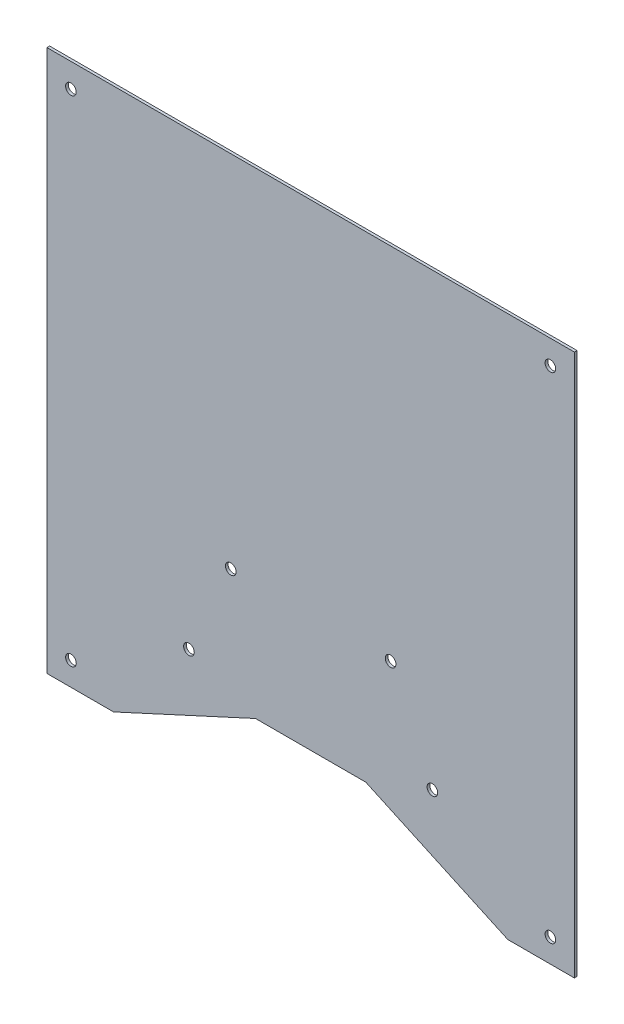
ISO-10303-21;
HEADER;
FILE_DESCRIPTION(('STEP AP214'),'2;1');
FILE_NAME('part.step','',(''),(''),'','','');
FILE_SCHEMA(('AUTOMOTIVE_DESIGN { 1 0 10303 214 1 1 1 1 }'));
ENDSEC;
DATA;
#1=APPLICATION_CONTEXT('core data for automotive mechanical design processes');
#2=APPLICATION_PROTOCOL_DEFINITION('international standard','automotive_design',2000,#1);
#3=PRODUCT_CONTEXT('',#1,'mechanical');
#4=PRODUCT('Part','Part','',(#3));
#5=PRODUCT_RELATED_PRODUCT_CATEGORY('part','',(#4));
#6=PRODUCT_DEFINITION_FORMATION('','',#4);
#7=PRODUCT_DEFINITION_CONTEXT('part definition',#1,'design');
#8=PRODUCT_DEFINITION('design','',#6,#7);
#9=PRODUCT_DEFINITION_SHAPE('','',#8);
#10=(LENGTH_UNIT() NAMED_UNIT(*) SI_UNIT(.MILLI.,.METRE.));
#11=(NAMED_UNIT(*) PLANE_ANGLE_UNIT() SI_UNIT($,.RADIAN.));
#12=(NAMED_UNIT(*) SI_UNIT($,.STERADIAN.) SOLID_ANGLE_UNIT());
#13=UNCERTAINTY_MEASURE_WITH_UNIT(LENGTH_MEASURE(1.E-05),#10,'distance_accuracy_value','');
#14=(GEOMETRIC_REPRESENTATION_CONTEXT(3) GLOBAL_UNCERTAINTY_ASSIGNED_CONTEXT((#13)) GLOBAL_UNIT_ASSIGNED_CONTEXT((#10,
#11,#12)) REPRESENTATION_CONTEXT('',''));
#15=CARTESIAN_POINT('',(0.,0.,0.));
#16=DIRECTION('',(0.,0.,1.));
#17=DIRECTION('',(1.,0.,0.));
#18=AXIS2_PLACEMENT_3D('',#15,#16,#17);
#19=CARTESIAN_POINT('',(0.,0.,0.));
#20=DIRECTION('',(0.,-1.,0.));
#21=DIRECTION('',(-1.,0.,0.));
#22=AXIS2_PLACEMENT_3D('',#19,#20,#21);
#23=PLANE('',#22);
#24=DIRECTION('',(0.,0.,1.));
#25=VECTOR('',#24,1.);
#26=CARTESIAN_POINT('',(-74.,0.,0.));
#27=LINE('',#26,#25);
#28=CARTESIAN_POINT('',(-74.,0.,0.));
#29=VERTEX_POINT('',#28);
#30=CARTESIAN_POINT('',(-74.,0.,1.));
#31=VERTEX_POINT('',#30);
#32=EDGE_CURVE('E142',#29,#31,#27,.T.);
#33=ORIENTED_EDGE('',*,*,#32,.T.);
#34=DIRECTION('',(1.,0.,0.));
#35=VECTOR('',#34,1.);
#36=CARTESIAN_POINT('',(-99.,0.,1.));
#37=LINE('',#36,#35);
#38=CARTESIAN_POINT('',(-99.,0.,1.));
#39=VERTEX_POINT('',#38);
#40=EDGE_CURVE('E206',#39,#31,#37,.T.);
#41=ORIENTED_EDGE('',*,*,#40,.F.);
#42=DIRECTION('',(0.,0.,-1.));
#43=VECTOR('',#42,1.);
#44=CARTESIAN_POINT('',(-99.,0.,1.));
#45=LINE('',#44,#43);
#46=CARTESIAN_POINT('',(-99.,0.,0.));
#47=VERTEX_POINT('',#46);
#48=EDGE_CURVE('E198',#39,#47,#45,.T.);
#49=ORIENTED_EDGE('',*,*,#48,.T.);
#50=DIRECTION('',(1.,0.,0.));
#51=VECTOR('',#50,1.);
#52=CARTESIAN_POINT('',(-99.,0.,0.));
#53=LINE('',#52,#51);
#54=EDGE_CURVE('E211',#47,#29,#53,.T.);
#55=ORIENTED_EDGE('',*,*,#54,.T.);
#56=EDGE_LOOP('',(#33,#41,#49,#55));
#57=FACE_BOUND('',#56,.T.);
#58=ADVANCED_FACE('F38',(#57),#23,.T.);
#59=CARTESIAN_POINT('',(-99.,203.5,1.));
#60=DIRECTION('',(0.,0.,-1.));
#61=DIRECTION('',(-1.,0.,0.));
#62=AXIS2_PLACEMENT_3D('',#59,#60,#61);
#63=PLANE('',#62);
#64=CARTESIAN_POINT('',(90.,194.5,1.));
#65=DIRECTION('',(0.,0.,1.));
#66=DIRECTION('',(1.,0.,0.));
#67=AXIS2_PLACEMENT_3D('',#64,#65,#66);
#68=CIRCLE('',#67,2.);
#69=CARTESIAN_POINT('',(92.,194.5,1.));
#70=VERTEX_POINT('',#69);
#71=EDGE_CURVE('E170',#70,#70,#68,.T.);
#72=ORIENTED_EDGE('',*,*,#71,.F.);
#73=EDGE_LOOP('',(#72));
#74=FACE_BOUND('',#73,.T.);
#75=CARTESIAN_POINT('',(-30.,68.5,1.));
#76=DIRECTION('',(0.,0.,1.));
#77=DIRECTION('',(1.,0.,0.));
#78=AXIS2_PLACEMENT_3D('',#75,#76,#77);
#79=CIRCLE('',#78,2.);
#80=CARTESIAN_POINT('',(-28.,68.5,1.));
#81=VERTEX_POINT('',#80);
#82=EDGE_CURVE('E176',#81,#81,#79,.T.);
#83=ORIENTED_EDGE('',*,*,#82,.F.);
#84=EDGE_LOOP('',(#83));
#85=FACE_BOUND('',#84,.T.);
#86=CARTESIAN_POINT('',(-90.,8.81999999999999,1.));
#87=DIRECTION('',(0.,0.,1.));
#88=DIRECTION('',(1.,0.,0.));
#89=AXIS2_PLACEMENT_3D('',#86,#87,#88);
#90=CIRCLE('',#89,2.);
#91=CARTESIAN_POINT('',(-88.,8.81999999999999,1.));
#92=VERTEX_POINT('',#91);
#93=EDGE_CURVE('E182',#92,#92,#90,.T.);
#94=ORIENTED_EDGE('',*,*,#93,.F.);
#95=EDGE_LOOP('',(#94));
#96=FACE_BOUND('',#95,.T.);
#97=CARTESIAN_POINT('',(90.,8.81999999999999,1.));
#98=DIRECTION('',(0.,0.,1.));
#99=DIRECTION('',(1.,0.,0.));
#100=AXIS2_PLACEMENT_3D('',#97,#98,#99);
#101=CIRCLE('',#100,2.);
#102=CARTESIAN_POINT('',(92.,8.81999999999999,1.));
#103=VERTEX_POINT('',#102);
#104=EDGE_CURVE('E151',#103,#103,#101,.T.);
#105=ORIENTED_EDGE('',*,*,#104,.F.);
#106=EDGE_LOOP('',(#105));
#107=FACE_BOUND('',#106,.T.);
#108=CARTESIAN_POINT('',(-45.7,34.51,1.));
#109=DIRECTION('',(0.,0.,1.));
#110=DIRECTION('',(1.,0.,0.));
#111=AXIS2_PLACEMENT_3D('',#108,#109,#110);
#112=CIRCLE('',#111,2.);
#113=CARTESIAN_POINT('',(-43.7,34.51,1.));
#114=VERTEX_POINT('',#113);
#115=EDGE_CURVE('E152',#114,#114,#112,.T.);
#116=ORIENTED_EDGE('',*,*,#115,.F.);
#117=EDGE_LOOP('',(#116));
#118=FACE_BOUND('',#117,.T.);
#119=CARTESIAN_POINT('',(45.7,34.51,1.));
#120=DIRECTION('',(0.,0.,1.));
#121=DIRECTION('',(1.,0.,0.));
#122=AXIS2_PLACEMENT_3D('',#119,#120,#121);
#123=CIRCLE('',#122,2.);
#124=CARTESIAN_POINT('',(47.7,34.51,1.));
#125=VERTEX_POINT('',#124);
#126=EDGE_CURVE('E158',#125,#125,#123,.T.);
#127=ORIENTED_EDGE('',*,*,#126,.F.);
#128=EDGE_LOOP('',(#127));
#129=FACE_BOUND('',#128,.T.);
#130=CARTESIAN_POINT('',(30.,68.5,1.));
#131=DIRECTION('',(0.,0.,1.));
#132=DIRECTION('',(-1.,0.,0.));
#133=AXIS2_PLACEMENT_3D('',#130,#131,#132);
#134=CIRCLE('',#133,2.);
#135=CARTESIAN_POINT('',(28.,68.5,1.));
#136=VERTEX_POINT('',#135);
#137=EDGE_CURVE('E145',#136,#136,#134,.T.);
#138=ORIENTED_EDGE('',*,*,#137,.F.);
#139=EDGE_LOOP('',(#138));
#140=FACE_BOUND('',#139,.T.);
#141=CARTESIAN_POINT('',(-90.,194.5,1.));
#142=DIRECTION('',(0.,0.,1.));
#143=DIRECTION('',(1.,0.,0.));
#144=AXIS2_PLACEMENT_3D('',#141,#142,#143);
#145=CIRCLE('',#144,2.);
#146=CARTESIAN_POINT('',(-88.,194.5,1.));
#147=VERTEX_POINT('',#146);
#148=EDGE_CURVE('E169',#147,#147,#145,.T.);
#149=ORIENTED_EDGE('',*,*,#148,.F.);
#150=EDGE_LOOP('',(#149));
#151=FACE_BOUND('',#150,.T.);
#152=ORIENTED_EDGE('',*,*,#40,.T.);
#153=DIRECTION('',(-0.908542219079559,-0.417793054214633,0.));
#154=VECTOR('',#153,1.);
#155=CARTESIAN_POINT('',(-74.,0.,1.));
#156=LINE('',#155,#154);
#157=CARTESIAN_POINT('',(-20.7,24.51,1.));
#158=VERTEX_POINT('',#157);
#159=EDGE_CURVE('E134',#158,#31,#156,.T.);
#160=ORIENTED_EDGE('',*,*,#159,.F.);
#161=DIRECTION('',(-1.,0.,0.));
#162=VECTOR('',#161,1.);
#163=CARTESIAN_POINT('',(-20.7,24.51,1.));
#164=LINE('',#163,#162);
#165=CARTESIAN_POINT('',(20.7,24.51,1.));
#166=VERTEX_POINT('',#165);
#167=EDGE_CURVE('E136',#166,#158,#164,.T.);
#168=ORIENTED_EDGE('',*,*,#167,.F.);
#169=DIRECTION('',(-0.908542219079559,0.417793054214633,0.));
#170=VECTOR('',#169,1.);
#171=CARTESIAN_POINT('',(20.7,24.51,1.));
#172=LINE('',#171,#170);
#173=CARTESIAN_POINT('',(74.,0.,1.));
#174=VERTEX_POINT('',#173);
#175=EDGE_CURVE('E114',#174,#166,#172,.T.);
#176=ORIENTED_EDGE('',*,*,#175,.F.);
#177=CARTESIAN_POINT('',(99.,0.,1.));
#178=VERTEX_POINT('',#177);
#179=EDGE_CURVE('E193',#174,#178,#37,.T.);
#180=ORIENTED_EDGE('',*,*,#179,.T.);
#181=DIRECTION('',(0.,-1.,0.));
#182=VECTOR('',#181,1.);
#183=CARTESIAN_POINT('',(99.,203.5,1.));
#184=LINE('',#183,#182);
#185=CARTESIAN_POINT('',(99.,203.5,1.));
#186=VERTEX_POINT('',#185);
#187=EDGE_CURVE('E11',#186,#178,#184,.T.);
#188=ORIENTED_EDGE('',*,*,#187,.F.);
#189=DIRECTION('',(1.,0.,0.));
#190=VECTOR('',#189,1.);
#191=CARTESIAN_POINT('',(-99.,203.5,1.));
#192=LINE('',#191,#190);
#193=CARTESIAN_POINT('',(-99.,203.5,1.));
#194=VERTEX_POINT('',#193);
#195=EDGE_CURVE('E88',#194,#186,#192,.T.);
#196=ORIENTED_EDGE('',*,*,#195,.F.);
#197=DIRECTION('',(0.,-1.,0.));
#198=VECTOR('',#197,1.);
#199=CARTESIAN_POINT('',(-99.,203.5,1.));
#200=LINE('',#199,#198);
#201=EDGE_CURVE('E62',#194,#39,#200,.T.);
#202=ORIENTED_EDGE('',*,*,#201,.T.);
#203=EDGE_LOOP('',(#152,#160,#168,#176,#180,#188,#196,#202));
#204=FACE_BOUND('',#203,.T.);
#205=ADVANCED_FACE('F40',(#74,#85,#96,#107,#118,#129,#140,#151,#204),#63,.F.);
#206=CARTESIAN_POINT('',(99.,203.5,0.));
#207=DIRECTION('',(1.,0.,0.));
#208=DIRECTION('',(0.,0.,-1.));
#209=AXIS2_PLACEMENT_3D('',#206,#207,#208);
#210=PLANE('',#209);
#211=DIRECTION('',(0.,0.,1.));
#212=VECTOR('',#211,1.);
#213=CARTESIAN_POINT('',(99.,0.,0.));
#214=LINE('',#213,#212);
#215=CARTESIAN_POINT('',(99.,0.,0.));
#216=VERTEX_POINT('',#215);
#217=EDGE_CURVE('E208',#216,#178,#214,.T.);
#218=ORIENTED_EDGE('',*,*,#217,.F.);
#219=DIRECTION('',(0.,-1.,0.));
#220=VECTOR('',#219,1.);
#221=CARTESIAN_POINT('',(99.,203.5,0.));
#222=LINE('',#221,#220);
#223=CARTESIAN_POINT('',(99.,203.5,0.));
#224=VERTEX_POINT('',#223);
#225=EDGE_CURVE('E46',#224,#216,#222,.T.);
#226=ORIENTED_EDGE('',*,*,#225,.F.);
#227=DIRECTION('',(0.,0.,1.));
#228=VECTOR('',#227,1.);
#229=CARTESIAN_POINT('',(99.,203.5,0.));
#230=LINE('',#229,#228);
#231=EDGE_CURVE('E197',#224,#186,#230,.T.);
#232=ORIENTED_EDGE('',*,*,#231,.T.);
#233=ORIENTED_EDGE('',*,*,#187,.T.);
#234=EDGE_LOOP('',(#218,#226,#232,#233));
#235=FACE_BOUND('',#234,.T.);
#236=ADVANCED_FACE('F221',(#235),#210,.T.);
#237=CARTESIAN_POINT('',(-99.,203.5,0.));
#238=DIRECTION('',(0.,0.,-1.));
#239=DIRECTION('',(-1.,0.,0.));
#240=AXIS2_PLACEMENT_3D('',#237,#238,#239);
#241=PLANE('',#240);
#242=DIRECTION('',(-0.908542219079559,-0.417793054214633,0.));
#243=VECTOR('',#242,1.);
#244=CARTESIAN_POINT('',(-74.,0.,0.));
#245=LINE('',#244,#243);
#246=CARTESIAN_POINT('',(-20.7,24.51,0.));
#247=VERTEX_POINT('',#246);
#248=EDGE_CURVE('E127',#247,#29,#245,.T.);
#249=ORIENTED_EDGE('',*,*,#248,.T.);
#250=ORIENTED_EDGE('',*,*,#54,.F.);
#251=DIRECTION('',(0.,-1.,0.));
#252=VECTOR('',#251,1.);
#253=CARTESIAN_POINT('',(-99.,203.5,0.));
#254=LINE('',#253,#252);
#255=CARTESIAN_POINT('',(-99.,203.5,0.));
#256=VERTEX_POINT('',#255);
#257=EDGE_CURVE('E217',#256,#47,#254,.T.);
#258=ORIENTED_EDGE('',*,*,#257,.F.);
#259=DIRECTION('',(1.,0.,0.));
#260=VECTOR('',#259,1.);
#261=CARTESIAN_POINT('',(-99.,203.5,0.));
#262=LINE('',#261,#260);
#263=EDGE_CURVE('E201',#256,#224,#262,.T.);
#264=ORIENTED_EDGE('',*,*,#263,.T.);
#265=ORIENTED_EDGE('',*,*,#225,.T.);
#266=CARTESIAN_POINT('',(74.,0.,0.));
#267=VERTEX_POINT('',#266);
#268=EDGE_CURVE('E133',#267,#216,#53,.T.);
#269=ORIENTED_EDGE('',*,*,#268,.F.);
#270=DIRECTION('',(-0.908542219079559,0.417793054214633,0.));
#271=VECTOR('',#270,1.);
#272=CARTESIAN_POINT('',(20.7,24.51,0.));
#273=LINE('',#272,#271);
#274=CARTESIAN_POINT('',(20.7,24.51,0.));
#275=VERTEX_POINT('',#274);
#276=EDGE_CURVE('E53',#267,#275,#273,.T.);
#277=ORIENTED_EDGE('',*,*,#276,.T.);
#278=DIRECTION('',(-1.,0.,0.));
#279=VECTOR('',#278,1.);
#280=CARTESIAN_POINT('',(-20.7,24.51,0.));
#281=LINE('',#280,#279);
#282=EDGE_CURVE('E122',#275,#247,#281,.T.);
#283=ORIENTED_EDGE('',*,*,#282,.T.);
#284=EDGE_LOOP('',(#249,#250,#258,#264,#265,#269,#277,#283));
#285=FACE_BOUND('',#284,.T.);
#286=CARTESIAN_POINT('',(90.,194.5,0.));
#287=DIRECTION('',(0.,0.,1.));
#288=DIRECTION('',(1.,0.,0.));
#289=AXIS2_PLACEMENT_3D('',#286,#287,#288);
#290=CIRCLE('',#289,2.);
#291=CARTESIAN_POINT('',(92.,194.5,0.));
#292=VERTEX_POINT('',#291);
#293=EDGE_CURVE('E166',#292,#292,#290,.T.);
#294=ORIENTED_EDGE('',*,*,#293,.T.);
#295=EDGE_LOOP('',(#294));
#296=FACE_BOUND('',#295,.T.);
#297=CARTESIAN_POINT('',(-30.,68.5,0.));
#298=DIRECTION('',(0.,0.,1.));
#299=DIRECTION('',(1.,0.,0.));
#300=AXIS2_PLACEMENT_3D('',#297,#298,#299);
#301=CIRCLE('',#300,2.);
#302=CARTESIAN_POINT('',(-28.,68.5,0.));
#303=VERTEX_POINT('',#302);
#304=EDGE_CURVE('E173',#303,#303,#301,.T.);
#305=ORIENTED_EDGE('',*,*,#304,.T.);
#306=EDGE_LOOP('',(#305));
#307=FACE_BOUND('',#306,.T.);
#308=CARTESIAN_POINT('',(-90.,8.81999999999999,0.));
#309=DIRECTION('',(0.,0.,1.));
#310=DIRECTION('',(1.,0.,0.));
#311=AXIS2_PLACEMENT_3D('',#308,#309,#310);
#312=CIRCLE('',#311,2.);
#313=CARTESIAN_POINT('',(-88.,8.81999999999999,0.));
#314=VERTEX_POINT('',#313);
#315=EDGE_CURVE('E179',#314,#314,#312,.T.);
#316=ORIENTED_EDGE('',*,*,#315,.T.);
#317=EDGE_LOOP('',(#316));
#318=FACE_BOUND('',#317,.T.);
#319=CARTESIAN_POINT('',(90.,8.81999999999999,0.));
#320=DIRECTION('',(0.,0.,1.));
#321=DIRECTION('',(1.,0.,0.));
#322=AXIS2_PLACEMENT_3D('',#319,#320,#321);
#323=CIRCLE('',#322,2.);
#324=CARTESIAN_POINT('',(92.,8.81999999999999,0.));
#325=VERTEX_POINT('',#324);
#326=EDGE_CURVE('E185',#325,#325,#323,.T.);
#327=ORIENTED_EDGE('',*,*,#326,.T.);
#328=EDGE_LOOP('',(#327));
#329=FACE_BOUND('',#328,.T.);
#330=CARTESIAN_POINT('',(-45.7,34.51,0.));
#331=DIRECTION('',(0.,0.,1.));
#332=DIRECTION('',(1.,0.,0.));
#333=AXIS2_PLACEMENT_3D('',#330,#331,#332);
#334=CIRCLE('',#333,2.);
#335=CARTESIAN_POINT('',(-43.7,34.51,0.));
#336=VERTEX_POINT('',#335);
#337=EDGE_CURVE('E148',#336,#336,#334,.T.);
#338=ORIENTED_EDGE('',*,*,#337,.T.);
#339=EDGE_LOOP('',(#338));
#340=FACE_BOUND('',#339,.T.);
#341=CARTESIAN_POINT('',(45.7,34.51,0.));
#342=DIRECTION('',(0.,0.,1.));
#343=DIRECTION('',(1.,0.,0.));
#344=AXIS2_PLACEMENT_3D('',#341,#342,#343);
#345=CIRCLE('',#344,2.);
#346=CARTESIAN_POINT('',(47.7,34.51,0.));
#347=VERTEX_POINT('',#346);
#348=EDGE_CURVE('E155',#347,#347,#345,.T.);
#349=ORIENTED_EDGE('',*,*,#348,.T.);
#350=EDGE_LOOP('',(#349));
#351=FACE_BOUND('',#350,.T.);
#352=CARTESIAN_POINT('',(30.,68.5,0.));
#353=DIRECTION('',(0.,0.,1.));
#354=DIRECTION('',(-1.,0.,0.));
#355=AXIS2_PLACEMENT_3D('',#352,#353,#354);
#356=CIRCLE('',#355,2.);
#357=CARTESIAN_POINT('',(28.,68.5,0.));
#358=VERTEX_POINT('',#357);
#359=EDGE_CURVE('E161',#358,#358,#356,.T.);
#360=ORIENTED_EDGE('',*,*,#359,.T.);
#361=EDGE_LOOP('',(#360));
#362=FACE_BOUND('',#361,.T.);
#363=CARTESIAN_POINT('',(-90.,194.5,0.));
#364=DIRECTION('',(0.,0.,1.));
#365=DIRECTION('',(1.,0.,0.));
#366=AXIS2_PLACEMENT_3D('',#363,#364,#365);
#367=CIRCLE('',#366,2.);
#368=CARTESIAN_POINT('',(-88.,194.5,0.));
#369=VERTEX_POINT('',#368);
#370=EDGE_CURVE('E190',#369,#369,#367,.T.);
#371=ORIENTED_EDGE('',*,*,#370,.T.);
#372=EDGE_LOOP('',(#371));
#373=FACE_BOUND('',#372,.T.);
#374=ADVANCED_FACE('F130',(#285,#296,#307,#318,#329,#340,#351,#362,#373),#241,.T.);
#375=CARTESIAN_POINT('',(-99.,203.5,1.));
#376=DIRECTION('',(-1.,0.,0.));
#377=DIRECTION('',(0.,0.,1.));
#378=AXIS2_PLACEMENT_3D('',#375,#376,#377);
#379=PLANE('',#378);
#380=ORIENTED_EDGE('',*,*,#48,.F.);
#381=ORIENTED_EDGE('',*,*,#201,.F.);
#382=DIRECTION('',(0.,0.,-1.));
#383=VECTOR('',#382,1.);
#384=CARTESIAN_POINT('',(-99.,203.5,1.));
#385=LINE('',#384,#383);
#386=EDGE_CURVE('E204',#194,#256,#385,.T.);
#387=ORIENTED_EDGE('',*,*,#386,.T.);
#388=ORIENTED_EDGE('',*,*,#257,.T.);
#389=EDGE_LOOP('',(#380,#381,#387,#388));
#390=FACE_BOUND('',#389,.T.);
#391=ADVANCED_FACE('F231',(#390),#379,.T.);
#392=CARTESIAN_POINT('',(0.,203.5,0.));
#393=DIRECTION('',(0.,-1.,0.));
#394=DIRECTION('',(-1.,0.,0.));
#395=AXIS2_PLACEMENT_3D('',#392,#393,#394);
#396=PLANE('',#395);
#397=ORIENTED_EDGE('',*,*,#195,.T.);
#398=ORIENTED_EDGE('',*,*,#231,.F.);
#399=ORIENTED_EDGE('',*,*,#263,.F.);
#400=ORIENTED_EDGE('',*,*,#386,.F.);
#401=EDGE_LOOP('',(#397,#398,#399,#400));
#402=FACE_BOUND('',#401,.T.);
#403=ADVANCED_FACE('F230',(#402),#396,.F.);
#404=DIRECTION('',(0.,0.,1.));
#405=VECTOR('',#404,1.);
#406=CARTESIAN_POINT('',(74.,0.,0.));
#407=LINE('',#406,#405);
#408=EDGE_CURVE('E119',#267,#174,#407,.T.);
#409=ORIENTED_EDGE('',*,*,#408,.F.);
#410=ORIENTED_EDGE('',*,*,#268,.T.);
#411=ORIENTED_EDGE('',*,*,#217,.T.);
#412=ORIENTED_EDGE('',*,*,#179,.F.);
#413=EDGE_LOOP('',(#409,#410,#411,#412));
#414=FACE_BOUND('',#413,.T.);
#415=ADVANCED_FACE('F224',(#414),#23,.T.);
#416=CARTESIAN_POINT('',(-90.,194.5,0.));
#417=DIRECTION('',(0.,0.,1.));
#418=DIRECTION('',(1.,0.,0.));
#419=AXIS2_PLACEMENT_3D('',#416,#417,#418);
#420=CYLINDRICAL_SURFACE('',#419,2.);
#421=ORIENTED_EDGE('',*,*,#370,.F.);
#422=EDGE_LOOP('',(#421));
#423=FACE_BOUND('',#422,.T.);
#424=ORIENTED_EDGE('',*,*,#148,.T.);
#425=EDGE_LOOP('',(#424));
#426=FACE_BOUND('',#425,.T.);
#427=ADVANCED_FACE('F247',(#423,#426),#420,.F.);
#428=CARTESIAN_POINT('',(30.,68.5,0.));
#429=DIRECTION('',(0.,0.,1.));
#430=DIRECTION('',(1.,0.,0.));
#431=AXIS2_PLACEMENT_3D('',#428,#429,#430);
#432=CYLINDRICAL_SURFACE('',#431,2.);
#433=ORIENTED_EDGE('',*,*,#359,.F.);
#434=EDGE_LOOP('',(#433));
#435=FACE_BOUND('',#434,.T.);
#436=ORIENTED_EDGE('',*,*,#137,.T.);
#437=EDGE_LOOP('',(#436));
#438=FACE_BOUND('',#437,.T.);
#439=ADVANCED_FACE('F251',(#435,#438),#432,.F.);
#440=CARTESIAN_POINT('',(45.7,34.51,0.));
#441=DIRECTION('',(0.,0.,1.));
#442=DIRECTION('',(1.,0.,0.));
#443=AXIS2_PLACEMENT_3D('',#440,#441,#442);
#444=CYLINDRICAL_SURFACE('',#443,2.);
#445=ORIENTED_EDGE('',*,*,#348,.F.);
#446=EDGE_LOOP('',(#445));
#447=FACE_BOUND('',#446,.T.);
#448=ORIENTED_EDGE('',*,*,#126,.T.);
#449=EDGE_LOOP('',(#448));
#450=FACE_BOUND('',#449,.T.);
#451=ADVANCED_FACE('F257',(#447,#450),#444,.F.);
#452=CARTESIAN_POINT('',(-45.7,34.51,0.));
#453=DIRECTION('',(0.,0.,1.));
#454=DIRECTION('',(1.,0.,0.));
#455=AXIS2_PLACEMENT_3D('',#452,#453,#454);
#456=CYLINDRICAL_SURFACE('',#455,2.);
#457=ORIENTED_EDGE('',*,*,#337,.F.);
#458=EDGE_LOOP('',(#457));
#459=FACE_BOUND('',#458,.T.);
#460=ORIENTED_EDGE('',*,*,#115,.T.);
#461=EDGE_LOOP('',(#460));
#462=FACE_BOUND('',#461,.T.);
#463=ADVANCED_FACE('F267',(#459,#462),#456,.F.);
#464=CARTESIAN_POINT('',(90.,8.81999999999999,0.));
#465=DIRECTION('',(0.,0.,1.));
#466=DIRECTION('',(1.,0.,0.));
#467=AXIS2_PLACEMENT_3D('',#464,#465,#466);
#468=CYLINDRICAL_SURFACE('',#467,2.);
#469=ORIENTED_EDGE('',*,*,#326,.F.);
#470=EDGE_LOOP('',(#469));
#471=FACE_BOUND('',#470,.T.);
#472=ORIENTED_EDGE('',*,*,#104,.T.);
#473=EDGE_LOOP('',(#472));
#474=FACE_BOUND('',#473,.T.);
#475=ADVANCED_FACE('F263',(#471,#474),#468,.F.);
#476=CARTESIAN_POINT('',(-90.,8.81999999999999,0.));
#477=DIRECTION('',(0.,0.,1.));
#478=DIRECTION('',(1.,0.,0.));
#479=AXIS2_PLACEMENT_3D('',#476,#477,#478);
#480=CYLINDRICAL_SURFACE('',#479,2.);
#481=ORIENTED_EDGE('',*,*,#315,.F.);
#482=EDGE_LOOP('',(#481));
#483=FACE_BOUND('',#482,.T.);
#484=ORIENTED_EDGE('',*,*,#93,.T.);
#485=EDGE_LOOP('',(#484));
#486=FACE_BOUND('',#485,.T.);
#487=ADVANCED_FACE('F266',(#483,#486),#480,.F.);
#488=CARTESIAN_POINT('',(-30.,68.5,0.));
#489=DIRECTION('',(0.,0.,1.));
#490=DIRECTION('',(1.,0.,0.));
#491=AXIS2_PLACEMENT_3D('',#488,#489,#490);
#492=CYLINDRICAL_SURFACE('',#491,2.);
#493=ORIENTED_EDGE('',*,*,#304,.F.);
#494=EDGE_LOOP('',(#493));
#495=FACE_BOUND('',#494,.T.);
#496=ORIENTED_EDGE('',*,*,#82,.T.);
#497=EDGE_LOOP('',(#496));
#498=FACE_BOUND('',#497,.T.);
#499=ADVANCED_FACE('F271',(#495,#498),#492,.F.);
#500=CARTESIAN_POINT('',(90.,194.5,0.));
#501=DIRECTION('',(0.,0.,1.));
#502=DIRECTION('',(1.,0.,0.));
#503=AXIS2_PLACEMENT_3D('',#500,#501,#502);
#504=CYLINDRICAL_SURFACE('',#503,2.);
#505=ORIENTED_EDGE('',*,*,#293,.F.);
#506=EDGE_LOOP('',(#505));
#507=FACE_BOUND('',#506,.T.);
#508=ORIENTED_EDGE('',*,*,#71,.T.);
#509=EDGE_LOOP('',(#508));
#510=FACE_BOUND('',#509,.T.);
#511=ADVANCED_FACE('F275',(#507,#510),#504,.F.);
#512=CARTESIAN_POINT('',(-74.,0.,0.));
#513=DIRECTION('',(-0.417793054214633,0.908542219079559,0.));
#514=DIRECTION('',(-0.908542219079559,-0.417793054214633,0.));
#515=AXIS2_PLACEMENT_3D('',#512,#513,#514);
#516=PLANE('',#515);
#517=ORIENTED_EDGE('',*,*,#159,.T.);
#518=ORIENTED_EDGE('',*,*,#32,.F.);
#519=ORIENTED_EDGE('',*,*,#248,.F.);
#520=DIRECTION('',(0.,0.,1.));
#521=VECTOR('',#520,1.);
#522=CARTESIAN_POINT('',(-20.7,24.51,0.));
#523=LINE('',#522,#521);
#524=EDGE_CURVE('E118',#247,#158,#523,.T.);
#525=ORIENTED_EDGE('',*,*,#524,.T.);
#526=EDGE_LOOP('',(#517,#518,#519,#525));
#527=FACE_BOUND('',#526,.T.);
#528=ADVANCED_FACE('F227',(#527),#516,.F.);
#529=CARTESIAN_POINT('',(-20.7,24.51,0.));
#530=DIRECTION('',(0.,1.,0.));
#531=DIRECTION('',(0.,0.,1.));
#532=AXIS2_PLACEMENT_3D('',#529,#530,#531);
#533=PLANE('',#532);
#534=ORIENTED_EDGE('',*,*,#167,.T.);
#535=ORIENTED_EDGE('',*,*,#524,.F.);
#536=ORIENTED_EDGE('',*,*,#282,.F.);
#537=DIRECTION('',(0.,0.,1.));
#538=VECTOR('',#537,1.);
#539=CARTESIAN_POINT('',(20.7,24.51,0.));
#540=LINE('',#539,#538);
#541=EDGE_CURVE('E110',#275,#166,#540,.T.);
#542=ORIENTED_EDGE('',*,*,#541,.T.);
#543=EDGE_LOOP('',(#534,#535,#536,#542));
#544=FACE_BOUND('',#543,.T.);
#545=ADVANCED_FACE('F123',(#544),#533,.F.);
#546=CARTESIAN_POINT('',(20.7,24.51,0.));
#547=DIRECTION('',(0.417793054214633,0.908542219079559,0.));
#548=DIRECTION('',(-0.908542219079559,0.417793054214633,0.));
#549=AXIS2_PLACEMENT_3D('',#546,#547,#548);
#550=PLANE('',#549);
#551=ORIENTED_EDGE('',*,*,#175,.T.);
#552=ORIENTED_EDGE('',*,*,#541,.F.);
#553=ORIENTED_EDGE('',*,*,#276,.F.);
#554=ORIENTED_EDGE('',*,*,#408,.T.);
#555=EDGE_LOOP('',(#551,#552,#553,#554));
#556=FACE_BOUND('',#555,.T.);
#557=ADVANCED_FACE('F112',(#556),#550,.F.);
#558=CLOSED_SHELL('',(#58,#205,#236,#374,#391,#403,#415,#427,#439,#451,#463,#475,#487,#499,#511,
#528,#545,#557));
#559=MANIFOLD_SOLID_BREP('B2',#558);
#560=ADVANCED_BREP_SHAPE_REPRESENTATION('',(#18,#559),#14);
#561=SHAPE_DEFINITION_REPRESENTATION(#9,#560);
ENDSEC;
END-ISO-10303-21;
